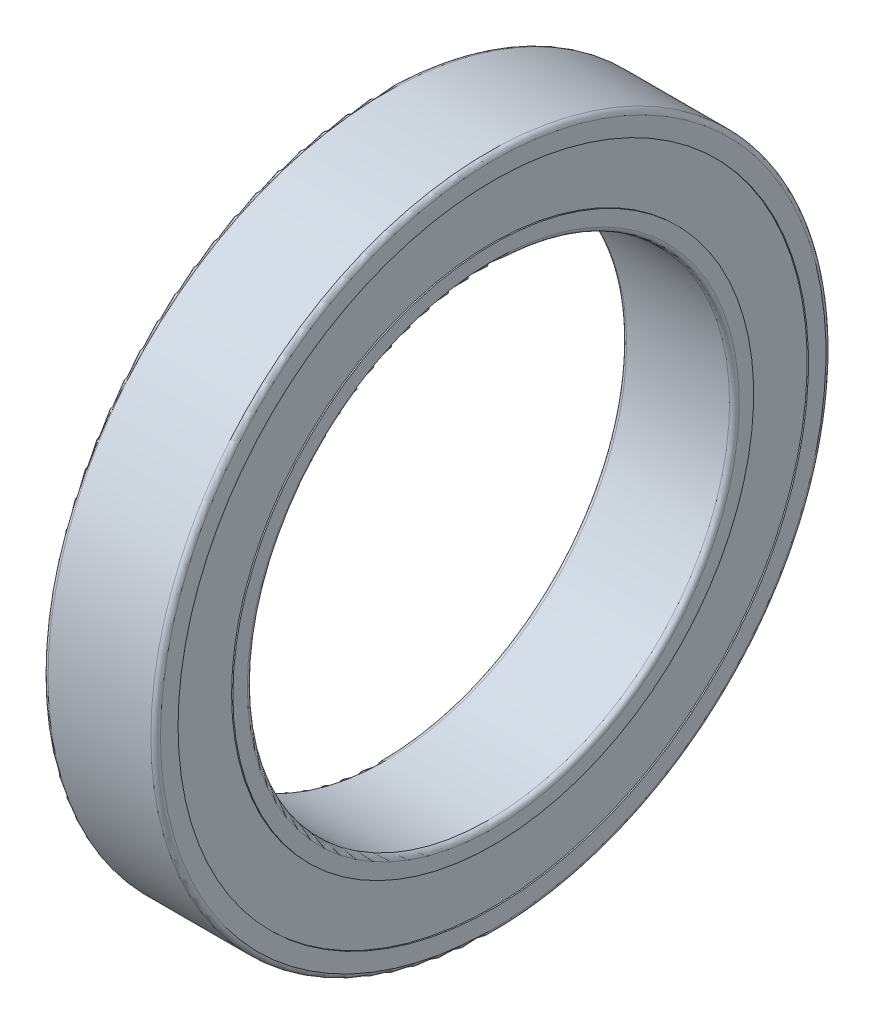
ISO-10303-21;
HEADER;
FILE_DESCRIPTION(('STEP AP214'),'2;1');
FILE_NAME('part.step','',(''),(''),'','','');
FILE_SCHEMA(('AUTOMOTIVE_DESIGN { 1 0 10303 214 1 1 1 1 }'));
ENDSEC;
DATA;
#1=APPLICATION_CONTEXT('core data for automotive mechanical design processes');
#2=APPLICATION_PROTOCOL_DEFINITION('international standard','automotive_design',2000,#1);
#3=PRODUCT_CONTEXT('',#1,'mechanical');
#4=PRODUCT('Part','Part','',(#3));
#5=PRODUCT_RELATED_PRODUCT_CATEGORY('part','',(#4));
#6=PRODUCT_DEFINITION_FORMATION('','',#4);
#7=PRODUCT_DEFINITION_CONTEXT('part definition',#1,'design');
#8=PRODUCT_DEFINITION('design','',#6,#7);
#9=PRODUCT_DEFINITION_SHAPE('','',#8);
#10=(LENGTH_UNIT() NAMED_UNIT(*) SI_UNIT(.MILLI.,.METRE.));
#11=(NAMED_UNIT(*) PLANE_ANGLE_UNIT() SI_UNIT($,.RADIAN.));
#12=(NAMED_UNIT(*) SI_UNIT($,.STERADIAN.) SOLID_ANGLE_UNIT());
#13=UNCERTAINTY_MEASURE_WITH_UNIT(LENGTH_MEASURE(1.E-05),#10,'distance_accuracy_value','');
#14=(GEOMETRIC_REPRESENTATION_CONTEXT(3) GLOBAL_UNCERTAINTY_ASSIGNED_CONTEXT((#13)) GLOBAL_UNIT_ASSIGNED_CONTEXT((#10,
#11,#12)) REPRESENTATION_CONTEXT('',''));
#15=CARTESIAN_POINT('',(0.,0.,0.));
#16=DIRECTION('',(0.,0.,1.));
#17=DIRECTION('',(1.,0.,0.));
#18=AXIS2_PLACEMENT_3D('',#15,#16,#17);
#19=CARTESIAN_POINT('',(0.,15.9382084617579,8.36501709678763));
#20=DIRECTION('',(-1.,0.,0.));
#21=DIRECTION('',(0.,0.885456025653216,0.464723172043757));
#22=AXIS2_PLACEMENT_3D('',#19,#20,#21);
#23=SPHERICAL_SURFACE('',#22,1.5);
#24=CARTESIAN_POINT('',(-1.5,15.9382084617579,8.36501709678763));
#25=VERTEX_POINT('',#24);
#26=VERTEX_LOOP('',#25);
#27=FACE_BOUND('',#26,.T.);
#28=ADVANCED_FACE('F39',(#27),#23,.T.);
#29=CLOSED_SHELL('',(#28));
#30=MANIFOLD_SOLID_BREP('B2',#29);
#31=CARTESIAN_POINT('',(0.,10.225165441161,14.8137095860857));
#32=DIRECTION('',(-1.,0.,0.));
#33=DIRECTION('',(0.,0.568064746731166,0.822983865893649));
#34=AXIS2_PLACEMENT_3D('',#31,#32,#33);
#35=SPHERICAL_SURFACE('',#34,1.5);
#36=CARTESIAN_POINT('',(-1.5,10.225165441161,14.8137095860857));
#37=VERTEX_POINT('',#36);
#38=VERTEX_LOOP('',#37);
#39=FACE_BOUND('',#38,.T.);
#40=ADVANCED_FACE('F57',(#39),#35,.T.);
#41=CLOSED_SHELL('',(#40));
#42=MANIFOLD_SOLID_BREP('B6',#41);
#43=CARTESIAN_POINT('',(0.,2.16966024459601,17.868759733765));
#44=DIRECTION('',(-1.,0.,0.));
#45=DIRECTION('',(0.,0.120536680255334,0.992708874098053));
#46=AXIS2_PLACEMENT_3D('',#43,#44,#45);
#47=SPHERICAL_SURFACE('',#46,1.5);
#48=CARTESIAN_POINT('',(-1.5,2.16966024459601,17.868759733765));
#49=VERTEX_POINT('',#48);
#50=VERTEX_LOOP('',#49);
#51=FACE_BOUND('',#50,.T.);
#52=ADVANCED_FACE('F75',(#51),#47,.T.);
#53=CLOSED_SHELL('',(#52));
#54=MANIFOLD_SOLID_BREP('B35',#53);
#55=CARTESIAN_POINT('',(0.,-6.38288796676548,16.8302923683375));
#56=DIRECTION('',(-1.,0.,0.));
#57=DIRECTION('',(0.,-0.354604887042527,0.935016242685418));
#58=AXIS2_PLACEMENT_3D('',#55,#56,#57);
#59=SPHERICAL_SURFACE('',#58,1.5);
#60=CARTESIAN_POINT('',(-1.5,-6.38288796676548,16.8302923683375));
#61=VERTEX_POINT('',#60);
#62=VERTEX_LOOP('',#61);
#63=FACE_BOUND('',#62,.T.);
#64=ADVANCED_FACE('F93',(#63),#59,.T.);
#65=CLOSED_SHELL('',(#64));
#66=MANIFOLD_SOLID_BREP('B53',#65);
#67=CARTESIAN_POINT('',(0.,-13.4731934670797,11.9362078483344));
#68=DIRECTION('',(-1.,0.,0.));
#69=DIRECTION('',(0.,-0.748510748171095,0.663122658240802));
#70=AXIS2_PLACEMENT_3D('',#67,#68,#69);
#71=SPHERICAL_SURFACE('',#70,1.5);
#72=CARTESIAN_POINT('',(-1.5,-13.4731934670797,11.9362078483344));
#73=VERTEX_POINT('',#72);
#74=VERTEX_LOOP('',#73);
#75=FACE_BOUND('',#74,.T.);
#76=ADVANCED_FACE('F111',(#75),#71,.T.);
#77=CLOSED_SHELL('',(#76));
#78=MANIFOLD_SOLID_BREP('B71',#77);
#79=CARTESIAN_POINT('',(0.,-17.4769527136689,4.30768195717617));
#80=DIRECTION('',(-1.,0.,0.));
#81=DIRECTION('',(0.,-0.97094181742605,0.239315664287565));
#82=AXIS2_PLACEMENT_3D('',#79,#80,#81);
#83=SPHERICAL_SURFACE('',#82,1.5);
#84=CARTESIAN_POINT('',(-1.5,-17.4769527136689,4.30768195717617));
#85=VERTEX_POINT('',#84);
#86=VERTEX_LOOP('',#85);
#87=FACE_BOUND('',#86,.T.);
#88=ADVANCED_FACE('F129',(#87),#83,.T.);
#89=CLOSED_SHELL('',(#88));
#90=MANIFOLD_SOLID_BREP('B89',#89);
#91=CARTESIAN_POINT('',(0.,-17.476952713669,-4.30768195717593));
#92=DIRECTION('',(-1.,0.,0.));
#93=DIRECTION('',(0.,-0.970941817426054,-0.239315664287552));
#94=AXIS2_PLACEMENT_3D('',#91,#92,#93);
#95=SPHERICAL_SURFACE('',#94,1.5);
#96=CARTESIAN_POINT('',(-1.5,-17.476952713669,-4.30768195717593));
#97=VERTEX_POINT('',#96);
#98=VERTEX_LOOP('',#97);
#99=FACE_BOUND('',#98,.T.);
#100=ADVANCED_FACE('F147',(#99),#95,.T.);
#101=CLOSED_SHELL('',(#100));
#102=MANIFOLD_SOLID_BREP('B107',#101);
#103=CARTESIAN_POINT('',(0.,-13.4731934670799,-11.9362078483342));
#104=DIRECTION('',(-1.,0.,0.));
#105=DIRECTION('',(0.,-0.748510748171105,-0.663122658240791));
#106=AXIS2_PLACEMENT_3D('',#103,#104,#105);
#107=SPHERICAL_SURFACE('',#106,1.5);
#108=CARTESIAN_POINT('',(-1.5,-13.4731934670799,-11.9362078483342));
#109=VERTEX_POINT('',#108);
#110=VERTEX_LOOP('',#109);
#111=FACE_BOUND('',#110,.T.);
#112=ADVANCED_FACE('F165',(#111),#107,.T.);
#113=CLOSED_SHELL('',(#112));
#114=MANIFOLD_SOLID_BREP('B125',#113);
#115=CARTESIAN_POINT('',(0.,-6.38288796676571,-16.8302923683374));
#116=DIRECTION('',(-1.,0.,0.));
#117=DIRECTION('',(0.,-0.35460488704254,-0.935016242685413));
#118=AXIS2_PLACEMENT_3D('',#115,#116,#117);
#119=SPHERICAL_SURFACE('',#118,1.5);
#120=CARTESIAN_POINT('',(-1.5,-6.38288796676571,-16.8302923683374));
#121=VERTEX_POINT('',#120);
#122=VERTEX_LOOP('',#121);
#123=FACE_BOUND('',#122,.T.);
#124=ADVANCED_FACE('F183',(#123),#119,.T.);
#125=CLOSED_SHELL('',(#124));
#126=MANIFOLD_SOLID_BREP('B143',#125);
#127=CARTESIAN_POINT('',(0.,2.16966024459576,-17.868759733765));
#128=DIRECTION('',(-1.,0.,0.));
#129=DIRECTION('',(0.,0.12053668025532,-0.992708874098054));
#130=AXIS2_PLACEMENT_3D('',#127,#128,#129);
#131=SPHERICAL_SURFACE('',#130,1.5);
#132=CARTESIAN_POINT('',(-1.5,2.16966024459576,-17.868759733765));
#133=VERTEX_POINT('',#132);
#134=VERTEX_LOOP('',#133);
#135=FACE_BOUND('',#134,.T.);
#136=ADVANCED_FACE('F201',(#135),#131,.T.);
#137=CLOSED_SHELL('',(#136));
#138=MANIFOLD_SOLID_BREP('B161',#137);
#139=CARTESIAN_POINT('',(0.,10.2251654411608,-14.8137095860858));
#140=DIRECTION('',(-1.,0.,0.));
#141=DIRECTION('',(0.,0.568064746731154,-0.822983865893658));
#142=AXIS2_PLACEMENT_3D('',#139,#140,#141);
#143=SPHERICAL_SURFACE('',#142,1.5);
#144=CARTESIAN_POINT('',(-1.5,10.2251654411608,-14.8137095860858));
#145=VERTEX_POINT('',#144);
#146=VERTEX_LOOP('',#145);
#147=FACE_BOUND('',#146,.T.);
#148=ADVANCED_FACE('F219',(#147),#143,.T.);
#149=CLOSED_SHELL('',(#148));
#150=MANIFOLD_SOLID_BREP('B179',#149);
#151=CARTESIAN_POINT('',(0.,15.9382084617578,-8.36501709678785));
#152=DIRECTION('',(-1.,0.,0.));
#153=DIRECTION('',(0.,0.885456025653209,-0.46472317204377));
#154=AXIS2_PLACEMENT_3D('',#151,#152,#153);
#155=SPHERICAL_SURFACE('',#154,1.5);
#156=CARTESIAN_POINT('',(-1.5,15.9382084617578,-8.36501709678785));
#157=VERTEX_POINT('',#156);
#158=VERTEX_LOOP('',#157);
#159=FACE_BOUND('',#158,.T.);
#160=ADVANCED_FACE('F237',(#159),#155,.T.);
#161=CLOSED_SHELL('',(#160));
#162=MANIFOLD_SOLID_BREP('B197',#161);
#163=CARTESIAN_POINT('',(0.,18.,0.));
#164=DIRECTION('',(-1.,0.,0.));
#165=DIRECTION('',(0.,1.,0.));
#166=AXIS2_PLACEMENT_3D('',#163,#164,#165);
#167=SPHERICAL_SURFACE('',#166,1.5);
#168=CARTESIAN_POINT('',(-1.5,18.,0.));
#169=VERTEX_POINT('',#168);
#170=VERTEX_LOOP('',#169);
#171=FACE_BOUND('',#170,.T.);
#172=ADVANCED_FACE('F257',(#171),#167,.T.);
#173=CLOSED_SHELL('',(#172));
#174=MANIFOLD_SOLID_BREP('B215',#173);
#175=CARTESIAN_POINT('',(-3.41950000000001,16.2,0.));
#176=DIRECTION('',(1.,0.,0.));
#177=DIRECTION('',(0.,0.,-1.));
#178=AXIS2_PLACEMENT_3D('',#175,#176,#177);
#179=PLANE('',#178);
#180=CARTESIAN_POINT('',(-3.41950000000001,0.,0.));
#181=DIRECTION('',(-1.,0.,0.));
#182=DIRECTION('',(0.,0.,1.));
#183=AXIS2_PLACEMENT_3D('',#180,#181,#182);
#184=CIRCLE('',#183,16.2);
#185=CARTESIAN_POINT('',(-3.41950000000001,0.,16.2));
#186=VERTEX_POINT('',#185);
#187=EDGE_CURVE('E291',#186,#186,#184,.T.);
#188=ORIENTED_EDGE('',*,*,#187,.F.);
#189=EDGE_LOOP('',(#188));
#190=FACE_BOUND('',#189,.T.);
#191=CARTESIAN_POINT('',(-3.41950000000001,0.,0.));
#192=DIRECTION('',(-1.,0.,0.));
#193=DIRECTION('',(0.,0.,1.));
#194=AXIS2_PLACEMENT_3D('',#191,#192,#193);
#195=CIRCLE('',#194,19.61);
#196=CARTESIAN_POINT('',(-3.41950000000001,0.,19.61));
#197=VERTEX_POINT('',#196);
#198=EDGE_CURVE('E256',#197,#197,#195,.T.);
#199=ORIENTED_EDGE('',*,*,#198,.T.);
#200=EDGE_LOOP('',(#199));
#201=FACE_BOUND('',#200,.T.);
#202=ADVANCED_FACE('F277',(#190,#201),#179,.F.);
#203=CARTESIAN_POINT('',(0.,0.,0.));
#204=DIRECTION('',(-1.,0.,0.));
#205=DIRECTION('',(0.,0.,1.));
#206=AXIS2_PLACEMENT_3D('',#203,#204,#205);
#207=CYLINDRICAL_SURFACE('',#206,19.61);
#208=ORIENTED_EDGE('',*,*,#198,.F.);
#209=EDGE_LOOP('',(#208));
#210=FACE_BOUND('',#209,.T.);
#211=CARTESIAN_POINT('',(-3.17800000000001,0.,0.));
#212=DIRECTION('',(-1.,0.,0.));
#213=DIRECTION('',(0.,0.,1.));
#214=AXIS2_PLACEMENT_3D('',#211,#212,#213);
#215=CIRCLE('',#214,19.61);
#216=CARTESIAN_POINT('',(-3.17800000000001,0.,19.61));
#217=VERTEX_POINT('',#216);
#218=EDGE_CURVE('E283',#217,#217,#215,.T.);
#219=ORIENTED_EDGE('',*,*,#218,.T.);
#220=EDGE_LOOP('',(#219));
#221=FACE_BOUND('',#220,.T.);
#222=ADVANCED_FACE('F300',(#210,#221),#207,.T.);
#223=CARTESIAN_POINT('',(-3.17800000000001,19.61,0.));
#224=DIRECTION('',(-1.,0.,0.));
#225=DIRECTION('',(0.,0.,1.));
#226=AXIS2_PLACEMENT_3D('',#223,#224,#225);
#227=PLANE('',#226);
#228=ORIENTED_EDGE('',*,*,#218,.F.);
#229=EDGE_LOOP('',(#228));
#230=FACE_BOUND('',#229,.T.);
#231=CARTESIAN_POINT('',(-3.17800000000001,0.,0.));
#232=DIRECTION('',(-1.,0.,0.));
#233=DIRECTION('',(0.,0.,1.));
#234=AXIS2_PLACEMENT_3D('',#231,#232,#233);
#235=CIRCLE('',#234,16.2);
#236=CARTESIAN_POINT('',(-3.17800000000001,0.,16.2));
#237=VERTEX_POINT('',#236);
#238=EDGE_CURVE('E287',#237,#237,#235,.T.);
#239=ORIENTED_EDGE('',*,*,#238,.T.);
#240=EDGE_LOOP('',(#239));
#241=FACE_BOUND('',#240,.T.);
#242=ADVANCED_FACE('F304',(#230,#241),#227,.F.);
#243=CARTESIAN_POINT('',(0.,0.,0.));
#244=DIRECTION('',(-1.,0.,0.));
#245=DIRECTION('',(0.,0.,1.));
#246=AXIS2_PLACEMENT_3D('',#243,#244,#245);
#247=CYLINDRICAL_SURFACE('',#246,16.2);
#248=ORIENTED_EDGE('',*,*,#238,.F.);
#249=EDGE_LOOP('',(#248));
#250=FACE_BOUND('',#249,.T.);
#251=ORIENTED_EDGE('',*,*,#187,.T.);
#252=EDGE_LOOP('',(#251));
#253=FACE_BOUND('',#252,.T.);
#254=ADVANCED_FACE('F297',(#250,#253),#247,.F.);
#255=CLOSED_SHELL('',(#202,#222,#242,#254));
#256=MANIFOLD_SOLID_BREP('B233',#255);
#257=CARTESIAN_POINT('',(0.,0.,0.));
#258=DIRECTION('',(-1.,0.,0.));
#259=DIRECTION('',(0.,0.,1.));
#260=AXIS2_PLACEMENT_3D('',#257,#258,#259);
#261=CYLINDRICAL_SURFACE('',#260,19.61);
#262=CARTESIAN_POINT('',(3.178,0.,0.));
#263=DIRECTION('',(-1.,0.,0.));
#264=DIRECTION('',(0.,0.,1.));
#265=AXIS2_PLACEMENT_3D('',#262,#263,#264);
#266=CIRCLE('',#265,19.61);
#267=CARTESIAN_POINT('',(3.178,0.,19.61));
#268=VERTEX_POINT('',#267);
#269=EDGE_CURVE('E276',#268,#268,#266,.T.);
#270=ORIENTED_EDGE('',*,*,#269,.F.);
#271=EDGE_LOOP('',(#270));
#272=FACE_BOUND('',#271,.T.);
#273=CARTESIAN_POINT('',(3.4195,0.,0.));
#274=DIRECTION('',(-1.,0.,0.));
#275=DIRECTION('',(0.,0.,1.));
#276=AXIS2_PLACEMENT_3D('',#273,#274,#275);
#277=CIRCLE('',#276,19.61);
#278=CARTESIAN_POINT('',(3.4195,0.,19.61));
#279=VERTEX_POINT('',#278);
#280=EDGE_CURVE('E364',#279,#279,#277,.T.);
#281=ORIENTED_EDGE('',*,*,#280,.T.);
#282=EDGE_LOOP('',(#281));
#283=FACE_BOUND('',#282,.T.);
#284=ADVANCED_FACE('F350',(#272,#283),#261,.T.);
#285=CARTESIAN_POINT('',(3.178,19.61,0.));
#286=DIRECTION('',(1.,0.,0.));
#287=DIRECTION('',(0.,0.,-1.));
#288=AXIS2_PLACEMENT_3D('',#285,#286,#287);
#289=PLANE('',#288);
#290=CARTESIAN_POINT('',(3.178,0.,0.));
#291=DIRECTION('',(-1.,0.,0.));
#292=DIRECTION('',(0.,0.,1.));
#293=AXIS2_PLACEMENT_3D('',#290,#291,#292);
#294=CIRCLE('',#293,16.2);
#295=CARTESIAN_POINT('',(3.178,0.,16.2));
#296=VERTEX_POINT('',#295);
#297=EDGE_CURVE('E356',#296,#296,#294,.T.);
#298=ORIENTED_EDGE('',*,*,#297,.F.);
#299=EDGE_LOOP('',(#298));
#300=FACE_BOUND('',#299,.T.);
#301=ORIENTED_EDGE('',*,*,#269,.T.);
#302=EDGE_LOOP('',(#301));
#303=FACE_BOUND('',#302,.T.);
#304=ADVANCED_FACE('F379',(#300,#303),#289,.F.);
#305=CARTESIAN_POINT('',(0.,0.,0.));
#306=DIRECTION('',(-1.,0.,0.));
#307=DIRECTION('',(0.,0.,1.));
#308=AXIS2_PLACEMENT_3D('',#305,#306,#307);
#309=CYLINDRICAL_SURFACE('',#308,16.2);
#310=CARTESIAN_POINT('',(3.4195,0.,0.));
#311=DIRECTION('',(-1.,0.,0.));
#312=DIRECTION('',(0.,0.,1.));
#313=AXIS2_PLACEMENT_3D('',#310,#311,#312);
#314=CIRCLE('',#313,16.2);
#315=CARTESIAN_POINT('',(3.4195,0.,16.2));
#316=VERTEX_POINT('',#315);
#317=EDGE_CURVE('E360',#316,#316,#314,.T.);
#318=ORIENTED_EDGE('',*,*,#317,.F.);
#319=EDGE_LOOP('',(#318));
#320=FACE_BOUND('',#319,.T.);
#321=ORIENTED_EDGE('',*,*,#297,.T.);
#322=EDGE_LOOP('',(#321));
#323=FACE_BOUND('',#322,.T.);
#324=ADVANCED_FACE('F374',(#320,#323),#309,.F.);
#325=CARTESIAN_POINT('',(3.4195,16.2,0.));
#326=DIRECTION('',(-1.,0.,0.));
#327=DIRECTION('',(0.,0.,1.));
#328=AXIS2_PLACEMENT_3D('',#325,#326,#327);
#329=PLANE('',#328);
#330=ORIENTED_EDGE('',*,*,#280,.F.);
#331=EDGE_LOOP('',(#330));
#332=FACE_BOUND('',#331,.T.);
#333=ORIENTED_EDGE('',*,*,#317,.T.);
#334=EDGE_LOOP('',(#333));
#335=FACE_BOUND('',#334,.T.);
#336=ADVANCED_FACE('F371',(#332,#335),#329,.F.);
#337=CLOSED_SHELL('',(#284,#304,#324,#336));
#338=MANIFOLD_SOLID_BREP('B251',#337);
#339=CARTESIAN_POINT('',(3.178,16.7,0.));
#340=DIRECTION('',(-1.,0.,0.));
#341=DIRECTION('',(0.,0.,1.));
#342=AXIS2_PLACEMENT_3D('',#339,#340,#341);
#343=PLANE('',#342);
#344=CARTESIAN_POINT('',(3.178,0.,0.));
#345=DIRECTION('',(-1.,0.,0.));
#346=DIRECTION('',(0.,0.,1.));
#347=AXIS2_PLACEMENT_3D('',#344,#345,#346);
#348=CIRCLE('',#347,16.7);
#349=CARTESIAN_POINT('',(3.178,0.,16.7));
#350=VERTEX_POINT('',#349);
#351=EDGE_CURVE('E462',#350,#350,#348,.T.);
#352=ORIENTED_EDGE('',*,*,#351,.F.);
#353=EDGE_LOOP('',(#352));
#354=FACE_BOUND('',#353,.T.);
#355=CARTESIAN_POINT('',(3.178,0.,0.));
#356=DIRECTION('',(-1.,0.,0.));
#357=DIRECTION('',(0.,0.,1.));
#358=AXIS2_PLACEMENT_3D('',#355,#356,#357);
#359=CIRCLE('',#358,16.2);
#360=CARTESIAN_POINT('',(3.178,0.,16.2));
#361=VERTEX_POINT('',#360);
#362=EDGE_CURVE('E349',#361,#361,#359,.T.);
#363=ORIENTED_EDGE('',*,*,#362,.T.);
#364=EDGE_LOOP('',(#363));
#365=FACE_BOUND('',#364,.T.);
#366=ADVANCED_FACE('F422',(#354,#365),#343,.F.);
#367=CARTESIAN_POINT('',(0.,0.,0.));
#368=DIRECTION('',(-1.,0.,0.));
#369=DIRECTION('',(0.,0.,1.));
#370=AXIS2_PLACEMENT_3D('',#367,#368,#369);
#371=CYLINDRICAL_SURFACE('',#370,16.2);
#372=ORIENTED_EDGE('',*,*,#362,.F.);
#373=EDGE_LOOP('',(#372));
#374=FACE_BOUND('',#373,.T.);
#375=CARTESIAN_POINT('',(3.5,0.,0.));
#376=DIRECTION('',(-1.,0.,0.));
#377=DIRECTION('',(0.,0.,1.));
#378=AXIS2_PLACEMENT_3D('',#375,#376,#377);
#379=CIRCLE('',#378,16.2);
#380=CARTESIAN_POINT('',(3.5,0.,16.2));
#381=VERTEX_POINT('',#380);
#382=EDGE_CURVE('E428',#381,#381,#379,.T.);
#383=ORIENTED_EDGE('',*,*,#382,.T.);
#384=EDGE_LOOP('',(#383));
#385=FACE_BOUND('',#384,.T.);
#386=ADVANCED_FACE('F469',(#374,#385),#371,.T.);
#387=CARTESIAN_POINT('',(3.5,16.2,0.));
#388=DIRECTION('',(-1.,0.,0.));
#389=DIRECTION('',(0.,0.,1.));
#390=AXIS2_PLACEMENT_3D('',#387,#388,#389);
#391=PLANE('',#390);
#392=ORIENTED_EDGE('',*,*,#382,.F.);
#393=EDGE_LOOP('',(#392));
#394=FACE_BOUND('',#393,.T.);
#395=CARTESIAN_POINT('',(3.5,0.,0.));
#396=DIRECTION('',(-1.,0.,0.));
#397=DIRECTION('',(0.,0.,1.));
#398=AXIS2_PLACEMENT_3D('',#395,#396,#397);
#399=CIRCLE('',#398,15.3);
#400=CARTESIAN_POINT('',(3.5,0.,15.3));
#401=VERTEX_POINT('',#400);
#402=EDGE_CURVE('E432',#401,#401,#399,.T.);
#403=ORIENTED_EDGE('',*,*,#402,.T.);
#404=EDGE_LOOP('',(#403));
#405=FACE_BOUND('',#404,.T.);
#406=ADVANCED_FACE('F473',(#394,#405),#391,.F.);
#407=CARTESIAN_POINT('',(3.2,0.,0.));
#408=DIRECTION('',(-1.,0.,0.));
#409=DIRECTION('',(0.,0.,1.));
#410=AXIS2_PLACEMENT_3D('',#407,#408,#409);
#411=TOROIDAL_SURFACE('',#410,15.3,0.299999999999999);
#412=ORIENTED_EDGE('',*,*,#402,.F.);
#413=EDGE_LOOP('',(#412));
#414=FACE_BOUND('',#413,.T.);
#415=CARTESIAN_POINT('',(3.2,0.,0.));
#416=DIRECTION('',(-1.,0.,0.));
#417=DIRECTION('',(0.,0.,1.));
#418=AXIS2_PLACEMENT_3D('',#415,#416,#417);
#419=CIRCLE('',#418,15.);
#420=CARTESIAN_POINT('',(3.2,0.,15.));
#421=VERTEX_POINT('',#420);
#422=EDGE_CURVE('E436',#421,#421,#419,.T.);
#423=ORIENTED_EDGE('',*,*,#422,.T.);
#424=EDGE_LOOP('',(#423));
#425=FACE_BOUND('',#424,.T.);
#426=ADVANCED_FACE('F478',(#414,#425),#411,.T.);
#427=CARTESIAN_POINT('',(0.,0.,0.));
#428=DIRECTION('',(-1.,0.,0.));
#429=DIRECTION('',(0.,0.,1.));
#430=AXIS2_PLACEMENT_3D('',#427,#428,#429);
#431=CYLINDRICAL_SURFACE('',#430,15.);
#432=ORIENTED_EDGE('',*,*,#422,.F.);
#433=EDGE_LOOP('',(#432));
#434=FACE_BOUND('',#433,.T.);
#435=CARTESIAN_POINT('',(-3.2,0.,0.));
#436=DIRECTION('',(-1.,0.,0.));
#437=DIRECTION('',(0.,0.,1.));
#438=AXIS2_PLACEMENT_3D('',#435,#436,#437);
#439=CIRCLE('',#438,15.);
#440=CARTESIAN_POINT('',(-3.2,0.,15.));
#441=VERTEX_POINT('',#440);
#442=EDGE_CURVE('E441',#441,#441,#439,.T.);
#443=ORIENTED_EDGE('',*,*,#442,.T.);
#444=EDGE_LOOP('',(#443));
#445=FACE_BOUND('',#444,.T.);
#446=ADVANCED_FACE('F484',(#434,#445),#431,.F.);
#447=CARTESIAN_POINT('',(-3.2,0.,0.));
#448=DIRECTION('',(-1.,0.,0.));
#449=DIRECTION('',(0.,0.,1.));
#450=AXIS2_PLACEMENT_3D('',#447,#448,#449);
#451=TOROIDAL_SURFACE('',#450,15.3,0.299999999999999);
#452=ORIENTED_EDGE('',*,*,#442,.F.);
#453=EDGE_LOOP('',(#452));
#454=FACE_BOUND('',#453,.T.);
#455=CARTESIAN_POINT('',(-3.5,0.,0.));
#456=DIRECTION('',(-1.,0.,0.));
#457=DIRECTION('',(0.,0.,1.));
#458=AXIS2_PLACEMENT_3D('',#455,#456,#457);
#459=CIRCLE('',#458,15.3);
#460=CARTESIAN_POINT('',(-3.5,0.,15.3));
#461=VERTEX_POINT('',#460);
#462=EDGE_CURVE('E444',#461,#461,#459,.T.);
#463=ORIENTED_EDGE('',*,*,#462,.T.);
#464=EDGE_LOOP('',(#463));
#465=FACE_BOUND('',#464,.T.);
#466=ADVANCED_FACE('F488',(#454,#465),#451,.T.);
#467=CARTESIAN_POINT('',(-3.5,16.2,0.));
#468=DIRECTION('',(1.,0.,0.));
#469=DIRECTION('',(0.,0.,-1.));
#470=AXIS2_PLACEMENT_3D('',#467,#468,#469);
#471=PLANE('',#470);
#472=ORIENTED_EDGE('',*,*,#462,.F.);
#473=EDGE_LOOP('',(#472));
#474=FACE_BOUND('',#473,.T.);
#475=CARTESIAN_POINT('',(-3.5,0.,0.));
#476=DIRECTION('',(-1.,0.,0.));
#477=DIRECTION('',(0.,0.,1.));
#478=AXIS2_PLACEMENT_3D('',#475,#476,#477);
#479=CIRCLE('',#478,16.2);
#480=CARTESIAN_POINT('',(-3.5,0.,16.2));
#481=VERTEX_POINT('',#480);
#482=EDGE_CURVE('E447',#481,#481,#479,.T.);
#483=ORIENTED_EDGE('',*,*,#482,.T.);
#484=EDGE_LOOP('',(#483));
#485=FACE_BOUND('',#484,.T.);
#486=ADVANCED_FACE('F492',(#474,#485),#471,.F.);
#487=CARTESIAN_POINT('',(0.,0.,0.));
#488=DIRECTION('',(-1.,0.,0.));
#489=DIRECTION('',(0.,0.,1.));
#490=AXIS2_PLACEMENT_3D('',#487,#488,#489);
#491=CYLINDRICAL_SURFACE('',#490,16.2);
#492=ORIENTED_EDGE('',*,*,#482,.F.);
#493=EDGE_LOOP('',(#492));
#494=FACE_BOUND('',#493,.T.);
#495=CARTESIAN_POINT('',(-3.178,0.,0.));
#496=DIRECTION('',(-1.,0.,0.));
#497=DIRECTION('',(0.,0.,1.));
#498=AXIS2_PLACEMENT_3D('',#495,#496,#497);
#499=CIRCLE('',#498,16.2);
#500=CARTESIAN_POINT('',(-3.178,0.,16.2));
#501=VERTEX_POINT('',#500);
#502=EDGE_CURVE('E450',#501,#501,#499,.T.);
#503=ORIENTED_EDGE('',*,*,#502,.T.);
#504=EDGE_LOOP('',(#503));
#505=FACE_BOUND('',#504,.T.);
#506=ADVANCED_FACE('F496',(#494,#505),#491,.T.);
#507=CARTESIAN_POINT('',(-3.178,16.7,0.));
#508=DIRECTION('',(1.,0.,0.));
#509=DIRECTION('',(0.,0.,-1.));
#510=AXIS2_PLACEMENT_3D('',#507,#508,#509);
#511=PLANE('',#510);
#512=ORIENTED_EDGE('',*,*,#502,.F.);
#513=EDGE_LOOP('',(#512));
#514=FACE_BOUND('',#513,.T.);
#515=CARTESIAN_POINT('',(-3.178,0.,0.));
#516=DIRECTION('',(-1.,0.,0.));
#517=DIRECTION('',(0.,0.,1.));
#518=AXIS2_PLACEMENT_3D('',#515,#516,#517);
#519=CIRCLE('',#518,16.7);
#520=CARTESIAN_POINT('',(-3.178,0.,16.7));
#521=VERTEX_POINT('',#520);
#522=EDGE_CURVE('E453',#521,#521,#519,.T.);
#523=ORIENTED_EDGE('',*,*,#522,.T.);
#524=EDGE_LOOP('',(#523));
#525=FACE_BOUND('',#524,.T.);
#526=ADVANCED_FACE('F500',(#514,#525),#511,.F.);
#527=CARTESIAN_POINT('',(0.,0.,0.));
#528=DIRECTION('',(-1.,0.,0.));
#529=DIRECTION('',(0.,0.,1.));
#530=AXIS2_PLACEMENT_3D('',#527,#528,#529);
#531=CYLINDRICAL_SURFACE('',#530,16.7);
#532=ORIENTED_EDGE('',*,*,#522,.F.);
#533=EDGE_LOOP('',(#532));
#534=FACE_BOUND('',#533,.T.);
#535=CARTESIAN_POINT('',(-0.748331477354791,0.,0.));
#536=DIRECTION('',(-1.,0.,0.));
#537=DIRECTION('',(0.,0.,1.));
#538=AXIS2_PLACEMENT_3D('',#535,#536,#537);
#539=CIRCLE('',#538,16.7);
#540=CARTESIAN_POINT('',(-0.748331477354791,0.,16.7));
#541=VERTEX_POINT('',#540);
#542=EDGE_CURVE('E456',#541,#541,#539,.T.);
#543=ORIENTED_EDGE('',*,*,#542,.T.);
#544=EDGE_LOOP('',(#543));
#545=FACE_BOUND('',#544,.T.);
#546=ADVANCED_FACE('F504',(#534,#545),#531,.T.);
#547=CARTESIAN_POINT('',(0.,0.,0.));
#548=DIRECTION('',(-1.,0.,0.));
#549=DIRECTION('',(0.,0.,1.));
#550=AXIS2_PLACEMENT_3D('',#547,#548,#549);
#551=TOROIDAL_SURFACE('',#550,18.,1.5);
#552=ORIENTED_EDGE('',*,*,#542,.F.);
#553=EDGE_LOOP('',(#552));
#554=FACE_BOUND('',#553,.T.);
#555=CARTESIAN_POINT('',(0.748331477354791,0.,0.));
#556=DIRECTION('',(-1.,0.,0.));
#557=DIRECTION('',(0.,0.,1.));
#558=AXIS2_PLACEMENT_3D('',#555,#556,#557);
#559=CIRCLE('',#558,16.7);
#560=CARTESIAN_POINT('',(0.748331477354791,0.,16.7));
#561=VERTEX_POINT('',#560);
#562=EDGE_CURVE('E459',#561,#561,#559,.T.);
#563=ORIENTED_EDGE('',*,*,#562,.T.);
#564=EDGE_LOOP('',(#563));
#565=FACE_BOUND('',#564,.T.);
#566=ADVANCED_FACE('F508',(#554,#565),#551,.F.);
#567=CARTESIAN_POINT('',(0.,0.,0.));
#568=DIRECTION('',(-1.,0.,0.));
#569=DIRECTION('',(0.,0.,1.));
#570=AXIS2_PLACEMENT_3D('',#567,#568,#569);
#571=CYLINDRICAL_SURFACE('',#570,16.7);
#572=ORIENTED_EDGE('',*,*,#562,.F.);
#573=EDGE_LOOP('',(#572));
#574=FACE_BOUND('',#573,.T.);
#575=ORIENTED_EDGE('',*,*,#351,.T.);
#576=EDGE_LOOP('',(#575));
#577=FACE_BOUND('',#576,.T.);
#578=ADVANCED_FACE('F466',(#574,#577),#571,.T.);
#579=CLOSED_SHELL('',(#366,#386,#406,#426,#446,#466,#486,#506,#526,#546,#566,#578));
#580=MANIFOLD_SOLID_BREP('B271',#579);
#581=CARTESIAN_POINT('',(0.,0.,0.));
#582=DIRECTION('',(-1.,0.,0.));
#583=DIRECTION('',(0.,0.,1.00000000000001));
#584=AXIS2_PLACEMENT_3D('',#581,#582,#583);
#585=CYLINDRICAL_SURFACE('',#584,19.61);
#586=CARTESIAN_POINT('',(3.5,0.,0.));
#587=DIRECTION('',(-1.,0.,0.));
#588=DIRECTION('',(0.,0.,1.00000000000001));
#589=AXIS2_PLACEMENT_3D('',#586,#587,#588);
#590=CIRCLE('',#589,19.61);
#591=CARTESIAN_POINT('',(3.5,0.,19.6100000000002));
#592=VERTEX_POINT('',#591);
#593=EDGE_CURVE('E421',#592,#592,#590,.T.);
#594=ORIENTED_EDGE('',*,*,#593,.F.);
#595=EDGE_LOOP('',(#594));
#596=FACE_BOUND('',#595,.T.);
#597=CARTESIAN_POINT('',(3.178,0.,0.));
#598=DIRECTION('',(-1.,0.,0.));
#599=DIRECTION('',(0.,0.,1.00000000000001));
#600=AXIS2_PLACEMENT_3D('',#597,#598,#599);
#601=CIRCLE('',#600,19.61);
#602=CARTESIAN_POINT('',(3.178,0.,19.6100000000002));
#603=VERTEX_POINT('',#602);
#604=EDGE_CURVE('E643',#603,#603,#601,.T.);
#605=ORIENTED_EDGE('',*,*,#604,.T.);
#606=EDGE_LOOP('',(#605));
#607=FACE_BOUND('',#606,.T.);
#608=ADVANCED_FACE('F603',(#596,#607),#585,.F.);
#609=CARTESIAN_POINT('',(3.50000000000049,20.7,0.));
#610=DIRECTION('',(-1.,0.,0.));
#611=DIRECTION('',(0.,0.,1.00000000000001));
#612=AXIS2_PLACEMENT_3D('',#609,#610,#611);
#613=PLANE('',#612);
#614=CARTESIAN_POINT('',(3.5,0.,0.));
#615=DIRECTION('',(-1.,0.,0.));
#616=DIRECTION('',(0.,0.,1.00000000000001));
#617=AXIS2_PLACEMENT_3D('',#614,#615,#616);
#618=CIRCLE('',#617,20.7);
#619=CARTESIAN_POINT('',(3.5,0.,20.7000000000002));
#620=VERTEX_POINT('',#619);
#621=EDGE_CURVE('E609',#620,#620,#618,.T.);
#622=ORIENTED_EDGE('',*,*,#621,.F.);
#623=EDGE_LOOP('',(#622));
#624=FACE_BOUND('',#623,.T.);
#625=ORIENTED_EDGE('',*,*,#593,.T.);
#626=EDGE_LOOP('',(#625));
#627=FACE_BOUND('',#626,.T.);
#628=ADVANCED_FACE('F704',(#624,#627),#613,.F.);
#629=CARTESIAN_POINT('',(3.19999999999999,0.,0.));
#630=DIRECTION('',(-1.,0.,0.));
#631=DIRECTION('',(0.,0.,1.00000000000001));
#632=AXIS2_PLACEMENT_3D('',#629,#630,#631);
#633=TOROIDAL_SURFACE('',#632,20.7,0.300000000000001);
#634=CARTESIAN_POINT('',(3.19999999999999,0.,0.));
#635=DIRECTION('',(-1.,0.,0.));
#636=DIRECTION('',(0.,0.,1.00000000000001));
#637=AXIS2_PLACEMENT_3D('',#634,#635,#636);
#638=CIRCLE('',#637,21.);
#639=CARTESIAN_POINT('',(3.19999999999999,0.,21.0000000000002));
#640=VERTEX_POINT('',#639);
#641=EDGE_CURVE('E613',#640,#640,#638,.T.);
#642=ORIENTED_EDGE('',*,*,#641,.F.);
#643=EDGE_LOOP('',(#642));
#644=FACE_BOUND('',#643,.T.);
#645=ORIENTED_EDGE('',*,*,#621,.T.);
#646=EDGE_LOOP('',(#645));
#647=FACE_BOUND('',#646,.T.);
#648=ADVANCED_FACE('F699',(#644,#647),#633,.T.);
#649=CARTESIAN_POINT('',(0.,0.,0.));
#650=DIRECTION('',(-1.,0.,0.));
#651=DIRECTION('',(0.,0.,1.00000000000001));
#652=AXIS2_PLACEMENT_3D('',#649,#650,#651);
#653=CYLINDRICAL_SURFACE('',#652,21.);
#654=CARTESIAN_POINT('',(-3.19999999999999,0.,0.));
#655=DIRECTION('',(-1.,0.,0.));
#656=DIRECTION('',(0.,0.,1.00000000000001));
#657=AXIS2_PLACEMENT_3D('',#654,#655,#656);
#658=CIRCLE('',#657,21.);
#659=CARTESIAN_POINT('',(-3.19999999999999,0.,21.0000000000002));
#660=VERTEX_POINT('',#659);
#661=EDGE_CURVE('E617',#660,#660,#658,.T.);
#662=ORIENTED_EDGE('',*,*,#661,.F.);
#663=EDGE_LOOP('',(#662));
#664=FACE_BOUND('',#663,.T.);
#665=ORIENTED_EDGE('',*,*,#641,.T.);
#666=EDGE_LOOP('',(#665));
#667=FACE_BOUND('',#666,.T.);
#668=ADVANCED_FACE('F693',(#664,#667),#653,.T.);
#669=CARTESIAN_POINT('',(-3.19999999999999,0.,0.));
#670=DIRECTION('',(-1.,0.,0.));
#671=DIRECTION('',(0.,0.,1.00000000000001));
#672=AXIS2_PLACEMENT_3D('',#669,#670,#671);
#673=TOROIDAL_SURFACE('',#672,20.7,0.300000000000001);
#674=CARTESIAN_POINT('',(-3.5,0.,0.));
#675=DIRECTION('',(-1.,0.,0.));
#676=DIRECTION('',(0.,0.,1.00000000000001));
#677=AXIS2_PLACEMENT_3D('',#674,#675,#676);
#678=CIRCLE('',#677,20.7);
#679=CARTESIAN_POINT('',(-3.5,0.,20.7000000000002));
#680=VERTEX_POINT('',#679);
#681=EDGE_CURVE('E622',#680,#680,#678,.T.);
#682=ORIENTED_EDGE('',*,*,#681,.F.);
#683=EDGE_LOOP('',(#682));
#684=FACE_BOUND('',#683,.T.);
#685=ORIENTED_EDGE('',*,*,#661,.T.);
#686=EDGE_LOOP('',(#685));
#687=FACE_BOUND('',#686,.T.);
#688=ADVANCED_FACE('F687',(#684,#687),#673,.T.);
#689=CARTESIAN_POINT('',(-3.4999999999995,20.7,0.));
#690=DIRECTION('',(1.,0.,0.));
#691=DIRECTION('',(0.,0.,-1.00000000000001));
#692=AXIS2_PLACEMENT_3D('',#689,#690,#691);
#693=PLANE('',#692);
#694=CARTESIAN_POINT('',(-3.5,0.,0.));
#695=DIRECTION('',(-1.,0.,0.));
#696=DIRECTION('',(0.,0.,1.00000000000001));
#697=AXIS2_PLACEMENT_3D('',#694,#695,#696);
#698=CIRCLE('',#697,19.61);
#699=CARTESIAN_POINT('',(-3.5,0.,19.6100000000002));
#700=VERTEX_POINT('',#699);
#701=EDGE_CURVE('E625',#700,#700,#698,.T.);
#702=ORIENTED_EDGE('',*,*,#701,.F.);
#703=EDGE_LOOP('',(#702));
#704=FACE_BOUND('',#703,.T.);
#705=ORIENTED_EDGE('',*,*,#681,.T.);
#706=EDGE_LOOP('',(#705));
#707=FACE_BOUND('',#706,.T.);
#708=ADVANCED_FACE('F681',(#704,#707),#693,.F.);
#709=CARTESIAN_POINT('',(0.,0.,0.));
#710=DIRECTION('',(-1.,0.,0.));
#711=DIRECTION('',(0.,0.,1.00000000000001));
#712=AXIS2_PLACEMENT_3D('',#709,#710,#711);
#713=CYLINDRICAL_SURFACE('',#712,19.61);
#714=CARTESIAN_POINT('',(-3.178,0.,0.));
#715=DIRECTION('',(-1.,0.,0.));
#716=DIRECTION('',(0.,0.,1.00000000000001));
#717=AXIS2_PLACEMENT_3D('',#714,#715,#716);
#718=CIRCLE('',#717,19.61);
#719=CARTESIAN_POINT('',(-3.178,0.,19.6100000000002));
#720=VERTEX_POINT('',#719);
#721=EDGE_CURVE('E628',#720,#720,#718,.T.);
#722=ORIENTED_EDGE('',*,*,#721,.F.);
#723=EDGE_LOOP('',(#722));
#724=FACE_BOUND('',#723,.T.);
#725=ORIENTED_EDGE('',*,*,#701,.T.);
#726=EDGE_LOOP('',(#725));
#727=FACE_BOUND('',#726,.T.);
#728=ADVANCED_FACE('F675',(#724,#727),#713,.F.);
#729=CARTESIAN_POINT('',(-3.1779999999995,19.6100000000003,-1.38777878078145E-13));
#730=DIRECTION('',(1.,0.,0.));
#731=DIRECTION('',(0.,0.,-1.00000000000001));
#732=AXIS2_PLACEMENT_3D('',#729,#730,#731);
#733=PLANE('',#732);
#734=CARTESIAN_POINT('',(-3.178,0.,0.));
#735=DIRECTION('',(-1.,0.,0.));
#736=DIRECTION('',(0.,0.,1.00000000000001));
#737=AXIS2_PLACEMENT_3D('',#734,#735,#736);
#738=CIRCLE('',#737,19.1);
#739=CARTESIAN_POINT('',(-3.178,0.,19.1000000000002));
#740=VERTEX_POINT('',#739);
#741=EDGE_CURVE('E631',#740,#740,#738,.T.);
#742=ORIENTED_EDGE('',*,*,#741,.F.);
#743=EDGE_LOOP('',(#742));
#744=FACE_BOUND('',#743,.T.);
#745=ORIENTED_EDGE('',*,*,#721,.T.);
#746=EDGE_LOOP('',(#745));
#747=FACE_BOUND('',#746,.T.);
#748=ADVANCED_FACE('F669',(#744,#747),#733,.F.);
#749=CARTESIAN_POINT('',(0.,0.,0.));
#750=DIRECTION('',(-1.,0.,0.));
#751=DIRECTION('',(0.,0.,1.00000000000001));
#752=AXIS2_PLACEMENT_3D('',#749,#750,#751);
#753=CYLINDRICAL_SURFACE('',#752,19.1);
#754=CARTESIAN_POINT('',(-1.01980390271855,0.,0.));
#755=DIRECTION('',(-1.,0.,0.));
#756=DIRECTION('',(0.,0.,1.00000000000001));
#757=AXIS2_PLACEMENT_3D('',#754,#755,#756);
#758=CIRCLE('',#757,19.1);
#759=CARTESIAN_POINT('',(-1.01980390271855,0.,19.1000000000002));
#760=VERTEX_POINT('',#759);
#761=EDGE_CURVE('E634',#760,#760,#758,.T.);
#762=ORIENTED_EDGE('',*,*,#761,.F.);
#763=EDGE_LOOP('',(#762));
#764=FACE_BOUND('',#763,.T.);
#765=ORIENTED_EDGE('',*,*,#741,.T.);
#766=EDGE_LOOP('',(#765));
#767=FACE_BOUND('',#766,.T.);
#768=ADVANCED_FACE('F663',(#764,#767),#753,.F.);
#769=CARTESIAN_POINT('',(0.,0.,0.));
#770=DIRECTION('',(-1.,0.,0.));
#771=DIRECTION('',(0.,0.,1.00000000000001));
#772=AXIS2_PLACEMENT_3D('',#769,#770,#771);
#773=TOROIDAL_SURFACE('',#772,18.,1.5);
#774=CARTESIAN_POINT('',(1.01980390271855,0.,0.));
#775=DIRECTION('',(-1.,0.,0.));
#776=DIRECTION('',(0.,0.,1.00000000000001));
#777=AXIS2_PLACEMENT_3D('',#774,#775,#776);
#778=CIRCLE('',#777,19.1);
#779=CARTESIAN_POINT('',(1.01980390271855,0.,19.1000000000002));
#780=VERTEX_POINT('',#779);
#781=EDGE_CURVE('E637',#780,#780,#778,.T.);
#782=ORIENTED_EDGE('',*,*,#781,.F.);
#783=EDGE_LOOP('',(#782));
#784=FACE_BOUND('',#783,.T.);
#785=ORIENTED_EDGE('',*,*,#761,.T.);
#786=EDGE_LOOP('',(#785));
#787=FACE_BOUND('',#786,.T.);
#788=ADVANCED_FACE('F657',(#784,#787),#773,.F.);
#789=CARTESIAN_POINT('',(0.,0.,0.));
#790=DIRECTION('',(-1.,0.,0.));
#791=DIRECTION('',(0.,0.,1.00000000000001));
#792=AXIS2_PLACEMENT_3D('',#789,#790,#791);
#793=CYLINDRICAL_SURFACE('',#792,19.1);
#794=CARTESIAN_POINT('',(3.178,0.,0.));
#795=DIRECTION('',(-1.,0.,0.));
#796=DIRECTION('',(0.,0.,1.00000000000001));
#797=AXIS2_PLACEMENT_3D('',#794,#795,#796);
#798=CIRCLE('',#797,19.1);
#799=CARTESIAN_POINT('',(3.178,0.,19.1000000000002));
#800=VERTEX_POINT('',#799);
#801=EDGE_CURVE('E640',#800,#800,#798,.T.);
#802=ORIENTED_EDGE('',*,*,#801,.F.);
#803=EDGE_LOOP('',(#802));
#804=FACE_BOUND('',#803,.T.);
#805=ORIENTED_EDGE('',*,*,#781,.T.);
#806=EDGE_LOOP('',(#805));
#807=FACE_BOUND('',#806,.T.);
#808=ADVANCED_FACE('F651',(#804,#807),#793,.F.);
#809=CARTESIAN_POINT('',(3.1780000000005,19.61,-1.66533453693773E-13));
#810=DIRECTION('',(-1.,0.,0.));
#811=DIRECTION('',(0.,0.,1.00000000000001));
#812=AXIS2_PLACEMENT_3D('',#809,#810,#811);
#813=PLANE('',#812);
#814=ORIENTED_EDGE('',*,*,#604,.F.);
#815=EDGE_LOOP('',(#814));
#816=FACE_BOUND('',#815,.T.);
#817=ORIENTED_EDGE('',*,*,#801,.T.);
#818=EDGE_LOOP('',(#817));
#819=FACE_BOUND('',#818,.T.);
#820=ADVANCED_FACE('F648',(#816,#819),#813,.F.);
#821=CLOSED_SHELL('',(#608,#628,#648,#668,#688,#708,#728,#748,#768,#788,#808,#820));
#822=MANIFOLD_SOLID_BREP('B344',#821);
#823=ADVANCED_BREP_SHAPE_REPRESENTATION('',(#18,#30,#42,#54,#66,#78,#90,#102,#114,#126,#138,
#150,#162,#174,#256,#338,#580,#822),#14);
#824=SHAPE_DEFINITION_REPRESENTATION(#9,#823);
ENDSEC;
END-ISO-10303-21;
